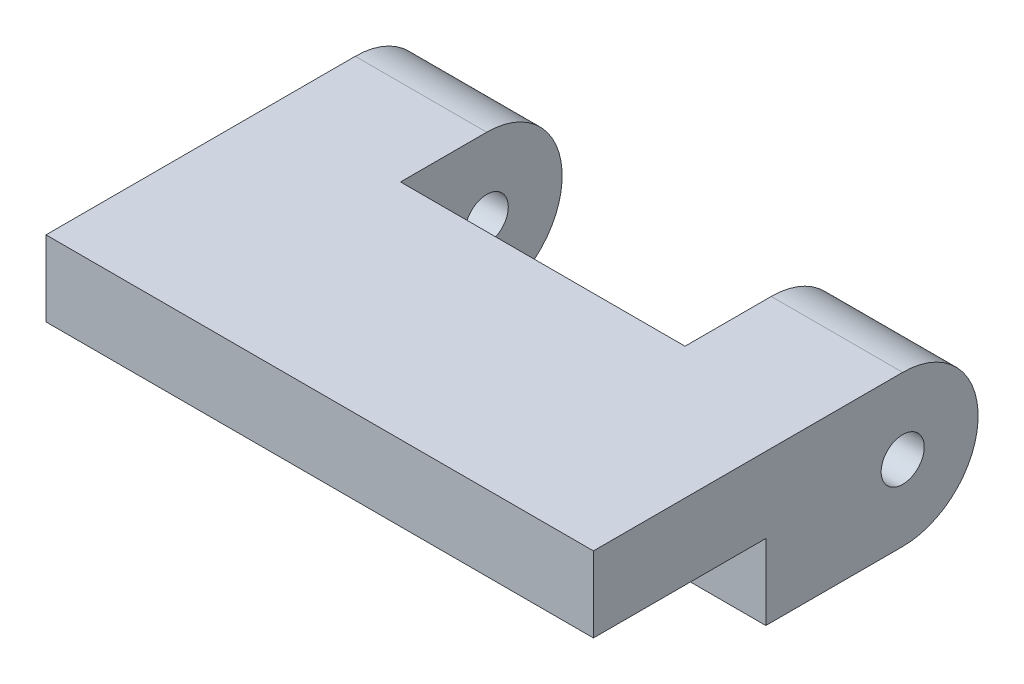
ISO-10303-21;
HEADER;
FILE_DESCRIPTION(('STEP AP214'),'2;1');
FILE_NAME('part.step','',(''),(''),'','','');
FILE_SCHEMA(('AUTOMOTIVE_DESIGN { 1 0 10303 214 1 1 1 1 }'));
ENDSEC;
DATA;
#1=APPLICATION_CONTEXT('core data for automotive mechanical design processes');
#2=APPLICATION_PROTOCOL_DEFINITION('international standard','automotive_design',2000,#1);
#3=PRODUCT_CONTEXT('',#1,'mechanical');
#4=PRODUCT('Part','Part','',(#3));
#5=PRODUCT_RELATED_PRODUCT_CATEGORY('part','',(#4));
#6=PRODUCT_DEFINITION_FORMATION('','',#4);
#7=PRODUCT_DEFINITION_CONTEXT('part definition',#1,'design');
#8=PRODUCT_DEFINITION('design','',#6,#7);
#9=PRODUCT_DEFINITION_SHAPE('','',#8);
#10=(LENGTH_UNIT() NAMED_UNIT(*) SI_UNIT(.MILLI.,.METRE.));
#11=(NAMED_UNIT(*) PLANE_ANGLE_UNIT() SI_UNIT($,.RADIAN.));
#12=(NAMED_UNIT(*) SI_UNIT($,.STERADIAN.) SOLID_ANGLE_UNIT());
#13=UNCERTAINTY_MEASURE_WITH_UNIT(LENGTH_MEASURE(1.E-05),#10,'distance_accuracy_value','');
#14=(GEOMETRIC_REPRESENTATION_CONTEXT(3) GLOBAL_UNCERTAINTY_ASSIGNED_CONTEXT((#13)) GLOBAL_UNIT_ASSIGNED_CONTEXT((#10,
#11,#12)) REPRESENTATION_CONTEXT('',''));
#15=CARTESIAN_POINT('',(0.,0.,0.));
#16=DIRECTION('',(0.,0.,1.));
#17=DIRECTION('',(1.,0.,0.));
#18=AXIS2_PLACEMENT_3D('',#15,#16,#17);
#19=CARTESIAN_POINT('',(12.7,-7.74000007400004,0.));
#20=DIRECTION('',(0.,1.,0.));
#21=DIRECTION('',(0.,0.,1.));
#22=AXIS2_PLACEMENT_3D('',#19,#20,#21);
#23=PLANE('',#22);
#24=DIRECTION('',(0.,0.,-1.));
#25=VECTOR('',#24,1.);
#26=CARTESIAN_POINT('',(-6.6,-7.74000007400004,0.));
#27=LINE('',#26,#25);
#28=CARTESIAN_POINT('',(-6.6,-7.740000074,48.6399999999323));
#29=VERTEX_POINT('',#28);
#30=CARTESIAN_POINT('',(-6.6,-7.740000074,44.6399999999323));
#31=VERTEX_POINT('',#30);
#32=EDGE_CURVE('E224',#29,#31,#27,.T.);
#33=ORIENTED_EDGE('',*,*,#32,.F.);
#34=DIRECTION('',(1.,0.,0.));
#35=VECTOR('',#34,1.);
#36=CARTESIAN_POINT('',(-6.6,-7.740000074,48.6399999999323));
#37=LINE('',#36,#35);
#38=CARTESIAN_POINT('',(6.6,-7.740000074,48.6399999999323));
#39=VERTEX_POINT('',#38);
#40=EDGE_CURVE('E158',#29,#39,#37,.T.);
#41=ORIENTED_EDGE('',*,*,#40,.T.);
#42=DIRECTION('',(0.,0.,-1.));
#43=VECTOR('',#42,1.);
#44=CARTESIAN_POINT('',(6.6,-7.74000007400004,0.));
#45=LINE('',#44,#43);
#46=CARTESIAN_POINT('',(6.6,-7.740000074,44.6399999999323));
#47=VERTEX_POINT('',#46);
#48=EDGE_CURVE('E228',#39,#47,#45,.T.);
#49=ORIENTED_EDGE('',*,*,#48,.T.);
#50=DIRECTION('',(-1.,0.,0.));
#51=VECTOR('',#50,1.);
#52=CARTESIAN_POINT('',(12.7,-7.740000074,44.6399999999323));
#53=LINE('',#52,#51);
#54=CARTESIAN_POINT('',(12.7,-7.740000074,44.6399999999323));
#55=VERTEX_POINT('',#54);
#56=EDGE_CURVE('E11',#55,#47,#53,.T.);
#57=ORIENTED_EDGE('',*,*,#56,.F.);
#58=DIRECTION('',(0.,0.,-1.));
#59=VECTOR('',#58,1.);
#60=CARTESIAN_POINT('',(12.7,-7.74000007400004,0.));
#61=LINE('',#60,#59);
#62=CARTESIAN_POINT('',(12.7,-7.74000007399999,50.9899999999323));
#63=VERTEX_POINT('',#62);
#64=EDGE_CURVE('E176',#63,#55,#61,.T.);
#65=ORIENTED_EDGE('',*,*,#64,.F.);
#66=DIRECTION('',(-1.,0.,0.));
#67=VECTOR('',#66,1.);
#68=CARTESIAN_POINT('',(12.7,-7.74000007399999,50.9899999999323));
#69=LINE('',#68,#67);
#70=CARTESIAN_POINT('',(-12.7,-7.74000007399999,50.9899999999323));
#71=VERTEX_POINT('',#70);
#72=EDGE_CURVE('E152',#63,#71,#69,.T.);
#73=ORIENTED_EDGE('',*,*,#72,.T.);
#74=DIRECTION('',(0.,0.,-1.));
#75=VECTOR('',#74,1.);
#76=CARTESIAN_POINT('',(-12.7,-7.74000007400004,0.));
#77=LINE('',#76,#75);
#78=CARTESIAN_POINT('',(-12.7,-7.740000074,44.6399999999323));
#79=VERTEX_POINT('',#78);
#80=EDGE_CURVE('E153',#71,#79,#77,.T.);
#81=ORIENTED_EDGE('',*,*,#80,.T.);
#82=EDGE_CURVE('E55',#31,#79,#53,.T.);
#83=ORIENTED_EDGE('',*,*,#82,.F.);
#84=EDGE_LOOP('',(#33,#41,#49,#57,#65,#73,#81,#83));
#85=FACE_BOUND('',#84,.T.);
#86=ADVANCED_FACE('F46',(#85),#23,.F.);
#87=CARTESIAN_POINT('',(12.7,-4.240000074,44.6399999999323));
#88=DIRECTION('',(-1.,0.,0.));
#89=DIRECTION('',(0.,0.,1.));
#90=AXIS2_PLACEMENT_3D('',#87,#88,#89);
#91=CYLINDRICAL_SURFACE('',#90,3.49999999999999);
#92=CARTESIAN_POINT('',(-6.6,-4.240000074,44.6399999999323));
#93=DIRECTION('',(1.,0.,0.));
#94=DIRECTION('',(0.,0.,-1.));
#95=AXIS2_PLACEMENT_3D('',#92,#93,#94);
#96=CIRCLE('',#95,3.49999999999999);
#97=CARTESIAN_POINT('',(-6.6,-0.740000074000001,44.6399999999323));
#98=VERTEX_POINT('',#97);
#99=EDGE_CURVE('E254',#31,#98,#96,.T.);
#100=ORIENTED_EDGE('',*,*,#99,.F.);
#101=ORIENTED_EDGE('',*,*,#82,.T.);
#102=CARTESIAN_POINT('',(-12.7,-4.240000074,44.6399999999323));
#103=DIRECTION('',(1.,0.,0.));
#104=DIRECTION('',(0.,0.,-1.));
#105=AXIS2_PLACEMENT_3D('',#102,#103,#104);
#106=CIRCLE('',#105,3.49999999999999);
#107=CARTESIAN_POINT('',(-12.7,-0.740000074000001,44.6399999999323));
#108=VERTEX_POINT('',#107);
#109=EDGE_CURVE('E157',#79,#108,#106,.T.);
#110=ORIENTED_EDGE('',*,*,#109,.T.);
#111=DIRECTION('',(-1.,0.,0.));
#112=VECTOR('',#111,1.);
#113=CARTESIAN_POINT('',(12.7,-0.740000074000001,44.6399999999323));
#114=LINE('',#113,#112);
#115=EDGE_CURVE('E183',#98,#108,#114,.T.);
#116=ORIENTED_EDGE('',*,*,#115,.F.);
#117=EDGE_LOOP('',(#100,#101,#110,#116));
#118=FACE_BOUND('',#117,.T.);
#119=ADVANCED_FACE('F203',(#118),#91,.T.);
#120=CARTESIAN_POINT('',(12.7,-0.740000073999963,0.));
#121=DIRECTION('',(0.,-1.,0.));
#122=DIRECTION('',(0.,0.,-1.));
#123=AXIS2_PLACEMENT_3D('',#120,#121,#122);
#124=PLANE('',#123);
#125=DIRECTION('',(0.,0.,1.));
#126=VECTOR('',#125,1.);
#127=CARTESIAN_POINT('',(-6.6,-0.740000073999963,0.));
#128=LINE('',#127,#126);
#129=CARTESIAN_POINT('',(-6.6,-0.740000073999997,48.6399999999323));
#130=VERTEX_POINT('',#129);
#131=EDGE_CURVE('E199',#98,#130,#128,.T.);
#132=ORIENTED_EDGE('',*,*,#131,.F.);
#133=ORIENTED_EDGE('',*,*,#115,.T.);
#134=DIRECTION('',(0.,0.,1.));
#135=VECTOR('',#134,1.);
#136=CARTESIAN_POINT('',(-12.7,-0.740000073999963,0.));
#137=LINE('',#136,#135);
#138=CARTESIAN_POINT('',(-12.7,-0.740000074000004,58.9899999999323));
#139=VERTEX_POINT('',#138);
#140=EDGE_CURVE('E162',#108,#139,#137,.T.);
#141=ORIENTED_EDGE('',*,*,#140,.T.);
#142=DIRECTION('',(-1.,0.,0.));
#143=VECTOR('',#142,1.);
#144=CARTESIAN_POINT('',(12.7,-0.740000074000004,58.9899999999323));
#145=LINE('',#144,#143);
#146=CARTESIAN_POINT('',(12.7,-0.740000074000004,58.9899999999323));
#147=VERTEX_POINT('',#146);
#148=EDGE_CURVE('E138',#147,#139,#145,.T.);
#149=ORIENTED_EDGE('',*,*,#148,.F.);
#150=DIRECTION('',(0.,0.,1.));
#151=VECTOR('',#150,1.);
#152=CARTESIAN_POINT('',(12.7,-0.740000073999963,0.));
#153=LINE('',#152,#151);
#154=CARTESIAN_POINT('',(12.7,-0.740000074000001,44.6399999999323));
#155=VERTEX_POINT('',#154);
#156=EDGE_CURVE('E124',#155,#147,#153,.T.);
#157=ORIENTED_EDGE('',*,*,#156,.F.);
#158=CARTESIAN_POINT('',(6.6,-0.740000074000001,44.6399999999323));
#159=VERTEX_POINT('',#158);
#160=EDGE_CURVE('E184',#155,#159,#114,.T.);
#161=ORIENTED_EDGE('',*,*,#160,.T.);
#162=DIRECTION('',(0.,0.,1.));
#163=VECTOR('',#162,1.);
#164=CARTESIAN_POINT('',(6.6,-0.740000073999963,0.));
#165=LINE('',#164,#163);
#166=CARTESIAN_POINT('',(6.6,-0.740000073999997,48.6399999999323));
#167=VERTEX_POINT('',#166);
#168=EDGE_CURVE('E234',#159,#167,#165,.T.);
#169=ORIENTED_EDGE('',*,*,#168,.T.);
#170=DIRECTION('',(1.,0.,0.));
#171=VECTOR('',#170,1.);
#172=CARTESIAN_POINT('',(-6.6,-0.740000073999997,48.6399999999323));
#173=LINE('',#172,#171);
#174=EDGE_CURVE('E220',#130,#167,#173,.T.);
#175=ORIENTED_EDGE('',*,*,#174,.F.);
#176=EDGE_LOOP('',(#132,#133,#141,#149,#157,#161,#169,#175));
#177=FACE_BOUND('',#176,.T.);
#178=ADVANCED_FACE('F194',(#177),#124,.F.);
#179=CARTESIAN_POINT('',(12.7,-4.240000074,44.6399999999323));
#180=DIRECTION('',(-1.,0.,0.));
#181=DIRECTION('',(0.,0.,1.));
#182=AXIS2_PLACEMENT_3D('',#179,#180,#181);
#183=CYLINDRICAL_SURFACE('',#182,0.999999999999998);
#184=CARTESIAN_POINT('',(-12.7,-4.240000074,44.6399999999323));
#185=DIRECTION('',(1.,0.,0.));
#186=DIRECTION('',(0.,0.,-1.));
#187=AXIS2_PLACEMENT_3D('',#184,#185,#186);
#188=CIRCLE('',#187,0.999999999999998);
#189=CARTESIAN_POINT('',(-12.7,-4.240000074,43.6399999999323));
#190=VERTEX_POINT('',#189);
#191=EDGE_CURVE('E172',#190,#190,#188,.T.);
#192=ORIENTED_EDGE('',*,*,#191,.F.);
#193=EDGE_LOOP('',(#192));
#194=FACE_BOUND('',#193,.T.);
#195=CARTESIAN_POINT('',(-6.6,-4.240000074,44.6399999999323));
#196=DIRECTION('',(1.,0.,0.));
#197=DIRECTION('',(0.,0.,-1.));
#198=AXIS2_PLACEMENT_3D('',#195,#196,#197);
#199=CIRCLE('',#198,0.999999999999998);
#200=CARTESIAN_POINT('',(-6.6,-4.240000074,43.6399999999323));
#201=VERTEX_POINT('',#200);
#202=EDGE_CURVE('E231',#201,#201,#199,.T.);
#203=ORIENTED_EDGE('',*,*,#202,.T.);
#204=EDGE_LOOP('',(#203));
#205=FACE_BOUND('',#204,.T.);
#206=ADVANCED_FACE('F294',(#194,#205),#183,.F.);
#207=ORIENTED_EDGE('',*,*,#56,.T.);
#208=CARTESIAN_POINT('',(6.6,-4.240000074,44.6399999999323));
#209=DIRECTION('',(1.,0.,0.));
#210=DIRECTION('',(0.,0.,-1.));
#211=AXIS2_PLACEMENT_3D('',#208,#209,#210);
#212=CIRCLE('',#211,3.49999999999999);
#213=EDGE_CURVE('E237',#47,#159,#212,.T.);
#214=ORIENTED_EDGE('',*,*,#213,.T.);
#215=ORIENTED_EDGE('',*,*,#160,.F.);
#216=CARTESIAN_POINT('',(12.7,-4.240000074,44.6399999999323));
#217=DIRECTION('',(1.,0.,0.));
#218=DIRECTION('',(0.,0.,-1.));
#219=AXIS2_PLACEMENT_3D('',#216,#217,#218);
#220=CIRCLE('',#219,3.49999999999999);
#221=EDGE_CURVE('E106',#55,#155,#220,.T.);
#222=ORIENTED_EDGE('',*,*,#221,.F.);
#223=EDGE_LOOP('',(#207,#214,#215,#222));
#224=FACE_BOUND('',#223,.T.);
#225=ADVANCED_FACE('F290',(#224),#91,.T.);
#226=CARTESIAN_POINT('',(12.7,0.,58.9899999999323));
#227=DIRECTION('',(0.,0.,-1.));
#228=DIRECTION('',(-1.,0.,0.));
#229=AXIS2_PLACEMENT_3D('',#226,#227,#228);
#230=PLANE('',#229);
#231=DIRECTION('',(0.,-1.,0.));
#232=VECTOR('',#231,1.);
#233=CARTESIAN_POINT('',(-12.7,0.,58.9899999999323));
#234=LINE('',#233,#232);
#235=CARTESIAN_POINT('',(-12.7,-4.240000074,58.9899999999323));
#236=VERTEX_POINT('',#235);
#237=EDGE_CURVE('E134',#139,#236,#234,.T.);
#238=ORIENTED_EDGE('',*,*,#237,.T.);
#239=DIRECTION('',(-1.,0.,0.));
#240=VECTOR('',#239,1.);
#241=CARTESIAN_POINT('',(12.7,-4.240000074,58.9899999999323));
#242=LINE('',#241,#240);
#243=CARTESIAN_POINT('',(12.7,-4.240000074,58.9899999999323));
#244=VERTEX_POINT('',#243);
#245=EDGE_CURVE('E131',#244,#236,#242,.T.);
#246=ORIENTED_EDGE('',*,*,#245,.F.);
#247=DIRECTION('',(0.,-1.,0.));
#248=VECTOR('',#247,1.);
#249=CARTESIAN_POINT('',(12.7,0.,58.9899999999323));
#250=LINE('',#249,#248);
#251=EDGE_CURVE('E116',#147,#244,#250,.T.);
#252=ORIENTED_EDGE('',*,*,#251,.F.);
#253=ORIENTED_EDGE('',*,*,#148,.T.);
#254=EDGE_LOOP('',(#238,#246,#252,#253));
#255=FACE_BOUND('',#254,.T.);
#256=ADVANCED_FACE('F132',(#255),#230,.F.);
#257=CARTESIAN_POINT('',(12.7,-4.24000007399999,0.));
#258=DIRECTION('',(0.,1.,0.));
#259=DIRECTION('',(0.,0.,1.));
#260=AXIS2_PLACEMENT_3D('',#257,#258,#259);
#261=PLANE('',#260);
#262=CARTESIAN_POINT('',(0.,-4.240000074,55.2399999999323));
#263=DIRECTION('',(0.,1.,0.));
#264=DIRECTION('',(0.,0.,1.));
#265=AXIS2_PLACEMENT_3D('',#262,#263,#264);
#266=CIRCLE('',#265,3.125);
#267=CARTESIAN_POINT('',(0.,-4.240000074,58.3649999999323));
#268=VERTEX_POINT('',#267);
#269=EDGE_CURVE('E49',#268,#268,#266,.T.);
#270=ORIENTED_EDGE('',*,*,#269,.T.);
#271=EDGE_LOOP('',(#270));
#272=FACE_BOUND('',#271,.T.);
#273=DIRECTION('',(0.,0.,-1.));
#274=VECTOR('',#273,1.);
#275=CARTESIAN_POINT('',(-12.7,-4.24000007399999,0.));
#276=LINE('',#275,#274);
#277=CARTESIAN_POINT('',(-12.7,-4.240000074,50.9899999999323));
#278=VERTEX_POINT('',#277);
#279=EDGE_CURVE('E167',#236,#278,#276,.T.);
#280=ORIENTED_EDGE('',*,*,#279,.T.);
#281=DIRECTION('',(-1.,0.,0.));
#282=VECTOR('',#281,1.);
#283=CARTESIAN_POINT('',(12.7,-4.240000074,50.9899999999323));
#284=LINE('',#283,#282);
#285=CARTESIAN_POINT('',(12.7,-4.240000074,50.9899999999323));
#286=VERTEX_POINT('',#285);
#287=EDGE_CURVE('E139',#286,#278,#284,.T.);
#288=ORIENTED_EDGE('',*,*,#287,.F.);
#289=DIRECTION('',(0.,0.,-1.));
#290=VECTOR('',#289,1.);
#291=CARTESIAN_POINT('',(12.7,-4.24000007399999,0.));
#292=LINE('',#291,#290);
#293=EDGE_CURVE('E121',#244,#286,#292,.T.);
#294=ORIENTED_EDGE('',*,*,#293,.F.);
#295=ORIENTED_EDGE('',*,*,#245,.T.);
#296=EDGE_LOOP('',(#280,#288,#294,#295));
#297=FACE_BOUND('',#296,.T.);
#298=ADVANCED_FACE('F141',(#272,#297),#261,.F.);
#299=CARTESIAN_POINT('',(12.7,0.,50.9899999999323));
#300=DIRECTION('',(0.,0.,-1.));
#301=DIRECTION('',(-1.,0.,0.));
#302=AXIS2_PLACEMENT_3D('',#299,#300,#301);
#303=PLANE('',#302);
#304=DIRECTION('',(0.,-1.,0.));
#305=VECTOR('',#304,1.);
#306=CARTESIAN_POINT('',(-12.7,0.,50.9899999999323));
#307=LINE('',#306,#305);
#308=EDGE_CURVE('E98',#278,#71,#307,.T.);
#309=ORIENTED_EDGE('',*,*,#308,.T.);
#310=ORIENTED_EDGE('',*,*,#72,.F.);
#311=DIRECTION('',(0.,-1.,0.));
#312=VECTOR('',#311,1.);
#313=CARTESIAN_POINT('',(12.7,0.,50.9899999999323));
#314=LINE('',#313,#312);
#315=EDGE_CURVE('E71',#286,#63,#314,.T.);
#316=ORIENTED_EDGE('',*,*,#315,.F.);
#317=ORIENTED_EDGE('',*,*,#287,.T.);
#318=EDGE_LOOP('',(#309,#310,#316,#317));
#319=FACE_BOUND('',#318,.T.);
#320=ADVANCED_FACE('F209',(#319),#303,.F.);
#321=CARTESIAN_POINT('',(6.6,-4.240000074,44.6399999999323));
#322=DIRECTION('',(1.,0.,0.));
#323=DIRECTION('',(0.,0.,-1.));
#324=AXIS2_PLACEMENT_3D('',#321,#322,#323);
#325=CIRCLE('',#324,0.999999999999998);
#326=CARTESIAN_POINT('',(6.6,-4.240000074,43.6399999999323));
#327=VERTEX_POINT('',#326);
#328=EDGE_CURVE('E241',#327,#327,#325,.T.);
#329=ORIENTED_EDGE('',*,*,#328,.F.);
#330=EDGE_LOOP('',(#329));
#331=FACE_BOUND('',#330,.T.);
#332=CARTESIAN_POINT('',(12.7,-4.240000074,44.6399999999323));
#333=DIRECTION('',(1.,0.,0.));
#334=DIRECTION('',(0.,0.,-1.));
#335=AXIS2_PLACEMENT_3D('',#332,#333,#334);
#336=CIRCLE('',#335,0.999999999999998);
#337=CARTESIAN_POINT('',(12.7,-4.240000074,43.6399999999323));
#338=VERTEX_POINT('',#337);
#339=EDGE_CURVE('E145',#338,#338,#336,.T.);
#340=ORIENTED_EDGE('',*,*,#339,.T.);
#341=EDGE_LOOP('',(#340));
#342=FACE_BOUND('',#341,.T.);
#343=ADVANCED_FACE('F304',(#331,#342),#183,.F.);
#344=CARTESIAN_POINT('',(12.7,0.,0.));
#345=DIRECTION('',(1.,0.,0.));
#346=DIRECTION('',(0.,0.,-1.));
#347=AXIS2_PLACEMENT_3D('',#344,#345,#346);
#348=PLANE('',#347);
#349=ORIENTED_EDGE('',*,*,#64,.T.);
#350=ORIENTED_EDGE('',*,*,#221,.T.);
#351=ORIENTED_EDGE('',*,*,#156,.T.);
#352=ORIENTED_EDGE('',*,*,#251,.T.);
#353=ORIENTED_EDGE('',*,*,#293,.T.);
#354=ORIENTED_EDGE('',*,*,#315,.T.);
#355=EDGE_LOOP('',(#349,#350,#351,#352,#353,#354));
#356=FACE_BOUND('',#355,.T.);
#357=ORIENTED_EDGE('',*,*,#339,.F.);
#358=EDGE_LOOP('',(#357));
#359=FACE_BOUND('',#358,.T.);
#360=ADVANCED_FACE('F118',(#356,#359),#348,.T.);
#361=CARTESIAN_POINT('',(-12.7,0.,0.));
#362=DIRECTION('',(1.,0.,0.));
#363=DIRECTION('',(0.,0.,-1.));
#364=AXIS2_PLACEMENT_3D('',#361,#362,#363);
#365=PLANE('',#364);
#366=ORIENTED_EDGE('',*,*,#80,.F.);
#367=ORIENTED_EDGE('',*,*,#308,.F.);
#368=ORIENTED_EDGE('',*,*,#279,.F.);
#369=ORIENTED_EDGE('',*,*,#237,.F.);
#370=ORIENTED_EDGE('',*,*,#140,.F.);
#371=ORIENTED_EDGE('',*,*,#109,.F.);
#372=EDGE_LOOP('',(#366,#367,#368,#369,#370,#371));
#373=FACE_BOUND('',#372,.T.);
#374=ORIENTED_EDGE('',*,*,#191,.T.);
#375=EDGE_LOOP('',(#374));
#376=FACE_BOUND('',#375,.T.);
#377=ADVANCED_FACE('F207',(#373,#376),#365,.F.);
#378=CARTESIAN_POINT('',(-6.6,0.,48.6399999999323));
#379=DIRECTION('',(0.,0.,1.));
#380=DIRECTION('',(1.,0.,0.));
#381=AXIS2_PLACEMENT_3D('',#378,#379,#380);
#382=PLANE('',#381);
#383=DIRECTION('',(0.,-1.,0.));
#384=VECTOR('',#383,1.);
#385=CARTESIAN_POINT('',(6.6,0.,48.6399999999323));
#386=LINE('',#385,#384);
#387=EDGE_CURVE('E62',#167,#39,#386,.T.);
#388=ORIENTED_EDGE('',*,*,#387,.T.);
#389=ORIENTED_EDGE('',*,*,#40,.F.);
#390=DIRECTION('',(0.,-1.,0.));
#391=VECTOR('',#390,1.);
#392=CARTESIAN_POINT('',(-6.6,0.,48.6399999999323));
#393=LINE('',#392,#391);
#394=EDGE_CURVE('E248',#130,#29,#393,.T.);
#395=ORIENTED_EDGE('',*,*,#394,.F.);
#396=ORIENTED_EDGE('',*,*,#174,.T.);
#397=EDGE_LOOP('',(#388,#389,#395,#396));
#398=FACE_BOUND('',#397,.T.);
#399=ADVANCED_FACE('F317',(#398),#382,.F.);
#400=CARTESIAN_POINT('',(-6.6,0.,0.));
#401=DIRECTION('',(1.,0.,0.));
#402=DIRECTION('',(0.,0.,-1.));
#403=AXIS2_PLACEMENT_3D('',#400,#401,#402);
#404=PLANE('',#403);
#405=ORIENTED_EDGE('',*,*,#202,.F.);
#406=EDGE_LOOP('',(#405));
#407=FACE_BOUND('',#406,.T.);
#408=ORIENTED_EDGE('',*,*,#99,.T.);
#409=ORIENTED_EDGE('',*,*,#131,.T.);
#410=ORIENTED_EDGE('',*,*,#394,.T.);
#411=ORIENTED_EDGE('',*,*,#32,.T.);
#412=EDGE_LOOP('',(#408,#409,#410,#411));
#413=FACE_BOUND('',#412,.T.);
#414=ADVANCED_FACE('F282',(#407,#413),#404,.T.);
#415=CARTESIAN_POINT('',(6.6,0.,0.));
#416=DIRECTION('',(1.,0.,0.));
#417=DIRECTION('',(0.,0.,-1.));
#418=AXIS2_PLACEMENT_3D('',#415,#416,#417);
#419=PLANE('',#418);
#420=ORIENTED_EDGE('',*,*,#328,.T.);
#421=EDGE_LOOP('',(#420));
#422=FACE_BOUND('',#421,.T.);
#423=ORIENTED_EDGE('',*,*,#213,.F.);
#424=ORIENTED_EDGE('',*,*,#48,.F.);
#425=ORIENTED_EDGE('',*,*,#387,.F.);
#426=ORIENTED_EDGE('',*,*,#168,.F.);
#427=EDGE_LOOP('',(#423,#424,#425,#426));
#428=FACE_BOUND('',#427,.T.);
#429=ADVANCED_FACE('F274',(#422,#428),#419,.F.);
#430=CARTESIAN_POINT('',(0.,-6.740000074,55.2399999999323));
#431=DIRECTION('',(0.,1.,0.));
#432=DIRECTION('',(0.,0.,1.));
#433=AXIS2_PLACEMENT_3D('',#430,#431,#432);
#434=CYLINDRICAL_SURFACE('',#433,3.125);
#435=CARTESIAN_POINT('',(0.,-2.240000074,55.2399999999323));
#436=DIRECTION('',(0.,1.,0.));
#437=DIRECTION('',(0.,0.,1.));
#438=AXIS2_PLACEMENT_3D('',#435,#436,#437);
#439=CIRCLE('',#438,3.125);
#440=CARTESIAN_POINT('',(0.,-2.240000074,58.3649999999323));
#441=VERTEX_POINT('',#440);
#442=EDGE_CURVE('E261',#441,#441,#439,.T.);
#443=ORIENTED_EDGE('',*,*,#442,.T.);
#444=EDGE_LOOP('',(#443));
#445=FACE_BOUND('',#444,.T.);
#446=ORIENTED_EDGE('',*,*,#269,.F.);
#447=EDGE_LOOP('',(#446));
#448=FACE_BOUND('',#447,.T.);
#449=ADVANCED_FACE('F271',(#445,#448),#434,.F.);
#450=CARTESIAN_POINT('',(0.,-2.240000074,55.2399999999323));
#451=DIRECTION('',(0.,1.,0.));
#452=DIRECTION('',(0.,0.,1.));
#453=AXIS2_PLACEMENT_3D('',#450,#451,#452);
#454=PLANE('',#453);
#455=ORIENTED_EDGE('',*,*,#442,.F.);
#456=EDGE_LOOP('',(#455));
#457=FACE_BOUND('',#456,.T.);
#458=ADVANCED_FACE('F273',(#457),#454,.F.);
#459=CLOSED_SHELL('',(#86,#119,#178,#206,#225,#256,#298,#320,#343,#360,#377,#399,#414,#429,#449,#458));
#460=MANIFOLD_SOLID_BREP('B2',#459);
#461=ADVANCED_BREP_SHAPE_REPRESENTATION('',(#18,#460),#14);
#462=SHAPE_DEFINITION_REPRESENTATION(#9,#461);
ENDSEC;
END-ISO-10303-21;
